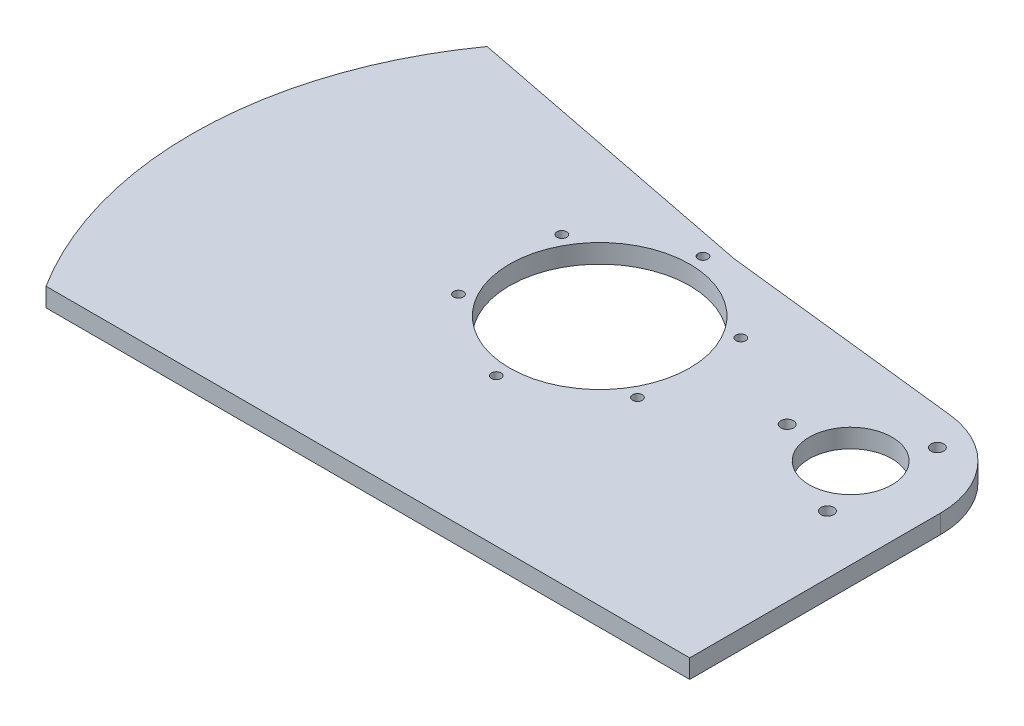
ISO-10303-21;
HEADER;
FILE_DESCRIPTION(('STEP AP214'),'2;1');
FILE_NAME('part.step','',(''),(''),'','','');
FILE_SCHEMA(('AUTOMOTIVE_DESIGN { 1 0 10303 214 1 1 1 1 }'));
ENDSEC;
DATA;
#1=APPLICATION_CONTEXT('core data for automotive mechanical design processes');
#2=APPLICATION_PROTOCOL_DEFINITION('international standard','automotive_design',2000,#1);
#3=PRODUCT_CONTEXT('',#1,'mechanical');
#4=PRODUCT('Part','Part','',(#3));
#5=PRODUCT_RELATED_PRODUCT_CATEGORY('part','',(#4));
#6=PRODUCT_DEFINITION_FORMATION('','',#4);
#7=PRODUCT_DEFINITION_CONTEXT('part definition',#1,'design');
#8=PRODUCT_DEFINITION('design','',#6,#7);
#9=PRODUCT_DEFINITION_SHAPE('','',#8);
#10=(LENGTH_UNIT() NAMED_UNIT(*) SI_UNIT(.MILLI.,.METRE.));
#11=(NAMED_UNIT(*) PLANE_ANGLE_UNIT() SI_UNIT($,.RADIAN.));
#12=(NAMED_UNIT(*) SI_UNIT($,.STERADIAN.) SOLID_ANGLE_UNIT());
#13=UNCERTAINTY_MEASURE_WITH_UNIT(LENGTH_MEASURE(1.E-05),#10,'distance_accuracy_value','');
#14=(GEOMETRIC_REPRESENTATION_CONTEXT(3) GLOBAL_UNCERTAINTY_ASSIGNED_CONTEXT((#13)) GLOBAL_UNIT_ASSIGNED_CONTEXT((#10,
#11,#12)) REPRESENTATION_CONTEXT('',''));
#15=CARTESIAN_POINT('',(0.,0.,0.));
#16=DIRECTION('',(0.,0.,1.));
#17=DIRECTION('',(1.,0.,0.));
#18=AXIS2_PLACEMENT_3D('',#15,#16,#17);
#19=CARTESIAN_POINT('',(4.47058823529412,3.175,-39.7493879302619));
#20=DIRECTION('',(0.111764705882353,0.,-0.993734698256547));
#21=DIRECTION('',(-0.993734698256547,0.,-0.111764705882353));
#22=AXIS2_PLACEMENT_3D('',#19,#20,#21);
#23=PLANE('',#22);
#24=DIRECTION('',(0.993734698256547,0.,0.111764705882353));
#25=VECTOR('',#24,1.);
#26=CARTESIAN_POINT('',(4.47058823529412,-3.175,-39.7493879302619));
#27=LINE('',#26,#25);
#28=CARTESIAN_POINT('',(6.09402337772681,-3.175,-39.5668012182034));
#29=VERTEX_POINT('',#28);
#30=CARTESIAN_POINT('',(88.4088235294118,-3.175,-30.3089082968247));
#31=VERTEX_POINT('',#30);
#32=EDGE_CURVE('E127',#29,#31,#27,.T.);
#33=ORIENTED_EDGE('',*,*,#32,.F.);
#34=DIRECTION('',(0.,-1.,0.));
#35=VECTOR('',#34,1.);
#36=CARTESIAN_POINT('',(6.09402337772681,3.175,-39.5668012182034));
#37=LINE('',#36,#35);
#38=CARTESIAN_POINT('',(6.09402337772681,3.175,-39.5668012182034));
#39=VERTEX_POINT('',#38);
#40=EDGE_CURVE('E11',#39,#29,#37,.T.);
#41=ORIENTED_EDGE('',*,*,#40,.F.);
#42=DIRECTION('',(0.993734698256547,0.,0.111764705882353));
#43=VECTOR('',#42,1.);
#44=CARTESIAN_POINT('',(4.47058823529412,3.175,-39.7493879302619));
#45=LINE('',#44,#43);
#46=CARTESIAN_POINT('',(88.4088235294118,3.175,-30.3089082968247));
#47=VERTEX_POINT('',#46);
#48=EDGE_CURVE('E148',#39,#47,#45,.T.);
#49=ORIENTED_EDGE('',*,*,#48,.T.);
#50=DIRECTION('',(0.,-1.,0.));
#51=VECTOR('',#50,1.);
#52=CARTESIAN_POINT('',(88.4088235294118,3.175,-30.3089082968247));
#53=LINE('',#52,#51);
#54=EDGE_CURVE('E83',#47,#31,#53,.T.);
#55=ORIENTED_EDGE('',*,*,#54,.T.);
#56=EDGE_LOOP('',(#33,#41,#49,#55));
#57=FACE_BOUND('',#56,.T.);
#58=ADVANCED_FACE('F39',(#57),#23,.T.);
#59=CARTESIAN_POINT('',(7.69716210747715,3.175,-39.2524355357883));
#60=DIRECTION('',(0.192429052686929,0.,-0.981310888394708));
#61=DIRECTION('',(-0.981310888394708,0.,-0.192429052686929));
#62=AXIS2_PLACEMENT_3D('',#59,#60,#61);
#63=PLANE('',#62);
#64=DIRECTION('',(0.981310888394708,0.,0.192429052686929));
#65=VECTOR('',#64,1.);
#66=CARTESIAN_POINT('',(7.69716210747715,-3.175,-39.2524355357883));
#67=LINE('',#66,#65);
#68=CARTESIAN_POINT('',(-98.1070843517429,-3.175,-60.));
#69=VERTEX_POINT('',#68);
#70=EDGE_CURVE('E130',#69,#29,#67,.T.);
#71=ORIENTED_EDGE('',*,*,#70,.F.);
#72=DIRECTION('',(0.,-1.,0.));
#73=VECTOR('',#72,1.);
#74=CARTESIAN_POINT('',(-98.1070843517429,3.175,-60.));
#75=LINE('',#74,#73);
#76=CARTESIAN_POINT('',(-98.1070843517429,3.175,-60.));
#77=VERTEX_POINT('',#76);
#78=EDGE_CURVE('E47',#77,#69,#75,.T.);
#79=ORIENTED_EDGE('',*,*,#78,.F.);
#80=DIRECTION('',(0.981310888394708,0.,0.192429052686929));
#81=VECTOR('',#80,1.);
#82=CARTESIAN_POINT('',(7.69716210747715,3.175,-39.2524355357883));
#83=LINE('',#82,#81);
#84=EDGE_CURVE('E161',#77,#39,#83,.T.);
#85=ORIENTED_EDGE('',*,*,#84,.T.);
#86=ORIENTED_EDGE('',*,*,#40,.T.);
#87=EDGE_LOOP('',(#71,#79,#85,#86));
#88=FACE_BOUND('',#87,.T.);
#89=ADVANCED_FACE('F160',(#88),#63,.T.);
#90=CARTESIAN_POINT('',(7.53083374487919,3.175,15.7669470165676));
#91=DIRECTION('',(0.,-1.,0.));
#92=DIRECTION('',(0.,0.,-1.));
#93=AXIS2_PLACEMENT_3D('',#90,#91,#92);
#94=CYLINDRICAL_SURFACE('',#93,130.);
#95=CARTESIAN_POINT('',(7.53083374487919,-3.175,15.7669470165676));
#96=DIRECTION('',(0.,1.,0.));
#97=DIRECTION('',(0.,0.,1.));
#98=AXIS2_PLACEMENT_3D('',#95,#96,#97);
#99=CIRCLE('',#98,130.);
#100=CARTESIAN_POINT('',(-102.5,-3.175,85.));
#101=VERTEX_POINT('',#100);
#102=EDGE_CURVE('E134',#69,#101,#99,.T.);
#103=ORIENTED_EDGE('',*,*,#102,.T.);
#104=DIRECTION('',(0.,-1.,0.));
#105=VECTOR('',#104,1.);
#106=CARTESIAN_POINT('',(-102.5,3.175,85.));
#107=LINE('',#106,#105);
#108=CARTESIAN_POINT('',(-102.5,3.175,85.));
#109=VERTEX_POINT('',#108);
#110=EDGE_CURVE('E106',#109,#101,#107,.T.);
#111=ORIENTED_EDGE('',*,*,#110,.F.);
#112=CARTESIAN_POINT('',(7.53083374487919,3.175,15.7669470165676));
#113=DIRECTION('',(0.,1.,0.));
#114=DIRECTION('',(0.,0.,1.));
#115=AXIS2_PLACEMENT_3D('',#112,#113,#114);
#116=CIRCLE('',#115,130.);
#117=EDGE_CURVE('E113',#77,#109,#116,.T.);
#118=ORIENTED_EDGE('',*,*,#117,.F.);
#119=ORIENTED_EDGE('',*,*,#78,.T.);
#120=EDGE_LOOP('',(#103,#111,#118,#119));
#121=FACE_BOUND('',#120,.T.);
#122=ADVANCED_FACE('F153',(#121),#94,.T.);
#123=CARTESIAN_POINT('',(0.,3.175,85.));
#124=DIRECTION('',(0.,0.,1.));
#125=DIRECTION('',(1.,0.,0.));
#126=AXIS2_PLACEMENT_3D('',#123,#124,#125);
#127=PLANE('',#126);
#128=DIRECTION('',(-1.,0.,0.));
#129=VECTOR('',#128,1.);
#130=CARTESIAN_POINT('',(0.,-3.175,85.));
#131=LINE('',#130,#129);
#132=CARTESIAN_POINT('',(115.5,-3.175,85.));
#133=VERTEX_POINT('',#132);
#134=EDGE_CURVE('E101',#133,#101,#131,.T.);
#135=ORIENTED_EDGE('',*,*,#134,.F.);
#136=DIRECTION('',(0.,-1.,0.));
#137=VECTOR('',#136,1.);
#138=CARTESIAN_POINT('',(115.5,3.175,85.));
#139=LINE('',#138,#137);
#140=CARTESIAN_POINT('',(115.5,3.175,85.));
#141=VERTEX_POINT('',#140);
#142=EDGE_CURVE('E96',#141,#133,#139,.T.);
#143=ORIENTED_EDGE('',*,*,#142,.F.);
#144=DIRECTION('',(-1.,0.,0.));
#145=VECTOR('',#144,1.);
#146=CARTESIAN_POINT('',(0.,3.175,85.));
#147=LINE('',#146,#145);
#148=EDGE_CURVE('E99',#141,#109,#147,.T.);
#149=ORIENTED_EDGE('',*,*,#148,.T.);
#150=ORIENTED_EDGE('',*,*,#110,.T.);
#151=EDGE_LOOP('',(#135,#143,#149,#150));
#152=FACE_BOUND('',#151,.T.);
#153=ADVANCED_FACE('F98',(#152),#127,.T.);
#154=CARTESIAN_POINT('',(115.5,3.175,0.));
#155=DIRECTION('',(1.,0.,0.));
#156=DIRECTION('',(0.,0.,-1.));
#157=AXIS2_PLACEMENT_3D('',#154,#155,#156);
#158=PLANE('',#157);
#159=DIRECTION('',(0.,0.,1.));
#160=VECTOR('',#159,1.);
#161=CARTESIAN_POINT('',(115.5,-3.175,0.));
#162=LINE('',#161,#160);
#163=CARTESIAN_POINT('',(115.5,-3.175,0.));
#164=VERTEX_POINT('',#163);
#165=EDGE_CURVE('E138',#164,#133,#162,.T.);
#166=ORIENTED_EDGE('',*,*,#165,.F.);
#167=DIRECTION('',(0.,-1.,0.));
#168=VECTOR('',#167,1.);
#169=CARTESIAN_POINT('',(115.5,3.175,0.));
#170=LINE('',#169,#168);
#171=CARTESIAN_POINT('',(115.5,3.175,0.));
#172=VERTEX_POINT('',#171);
#173=EDGE_CURVE('E76',#172,#164,#170,.T.);
#174=ORIENTED_EDGE('',*,*,#173,.F.);
#175=DIRECTION('',(0.,0.,1.));
#176=VECTOR('',#175,1.);
#177=CARTESIAN_POINT('',(115.5,3.175,0.));
#178=LINE('',#177,#176);
#179=EDGE_CURVE('E110',#172,#141,#178,.T.);
#180=ORIENTED_EDGE('',*,*,#179,.T.);
#181=ORIENTED_EDGE('',*,*,#142,.T.);
#182=EDGE_LOOP('',(#166,#174,#180,#181));
#183=FACE_BOUND('',#182,.T.);
#184=ADVANCED_FACE('F116',(#183),#158,.T.);
#185=CARTESIAN_POINT('',(0.,3.175,0.));
#186=DIRECTION('',(0.,-1.,0.));
#187=DIRECTION('',(0.,0.,-1.));
#188=AXIS2_PLACEMENT_3D('',#185,#186,#187);
#189=CYLINDRICAL_SURFACE('',#188,30.5);
#190=CARTESIAN_POINT('',(0.,3.175,0.));
#191=DIRECTION('',(0.,1.,0.));
#192=DIRECTION('',(0.,0.,1.));
#193=AXIS2_PLACEMENT_3D('',#190,#191,#192);
#194=CIRCLE('',#193,30.5);
#195=CARTESIAN_POINT('',(0.,3.175,30.5));
#196=VERTEX_POINT('',#195);
#197=EDGE_CURVE('E118',#196,#196,#194,.T.);
#198=ORIENTED_EDGE('',*,*,#197,.T.);
#199=EDGE_LOOP('',(#198));
#200=FACE_BOUND('',#199,.T.);
#201=CARTESIAN_POINT('',(0.,-3.175,0.));
#202=DIRECTION('',(0.,1.,0.));
#203=DIRECTION('',(0.,0.,1.));
#204=AXIS2_PLACEMENT_3D('',#201,#202,#203);
#205=CIRCLE('',#204,30.5);
#206=CARTESIAN_POINT('',(0.,-3.175,30.5));
#207=VERTEX_POINT('',#206);
#208=EDGE_CURVE('E142',#207,#207,#205,.T.);
#209=ORIENTED_EDGE('',*,*,#208,.F.);
#210=EDGE_LOOP('',(#209));
#211=FACE_BOUND('',#210,.T.);
#212=ADVANCED_FACE('F270',(#200,#211),#189,.F.);
#213=CARTESIAN_POINT('',(85.,3.175,0.));
#214=DIRECTION('',(0.,-1.,0.));
#215=DIRECTION('',(0.,0.,-1.));
#216=AXIS2_PLACEMENT_3D('',#213,#214,#215);
#217=CYLINDRICAL_SURFACE('',#216,30.5);
#218=CARTESIAN_POINT('',(85.,-3.175,0.));
#219=DIRECTION('',(0.,1.,0.));
#220=DIRECTION('',(0.,0.,1.));
#221=AXIS2_PLACEMENT_3D('',#218,#219,#220);
#222=CIRCLE('',#221,30.5);
#223=EDGE_CURVE('E140',#164,#31,#222,.T.);
#224=ORIENTED_EDGE('',*,*,#223,.T.);
#225=ORIENTED_EDGE('',*,*,#54,.F.);
#226=CARTESIAN_POINT('',(85.,3.175,0.));
#227=DIRECTION('',(0.,1.,0.));
#228=DIRECTION('',(0.,0.,1.));
#229=AXIS2_PLACEMENT_3D('',#226,#227,#228);
#230=CIRCLE('',#229,30.5);
#231=EDGE_CURVE('E55',#172,#47,#230,.T.);
#232=ORIENTED_EDGE('',*,*,#231,.F.);
#233=ORIENTED_EDGE('',*,*,#173,.T.);
#234=EDGE_LOOP('',(#224,#225,#232,#233));
#235=FACE_BOUND('',#234,.T.);
#236=ADVANCED_FACE('F162',(#235),#217,.T.);
#237=CARTESIAN_POINT('',(85.,3.175,0.));
#238=DIRECTION('',(0.,-1.,0.));
#239=DIRECTION('',(0.,0.,-1.));
#240=AXIS2_PLACEMENT_3D('',#237,#238,#239);
#241=CYLINDRICAL_SURFACE('',#240,14.);
#242=CARTESIAN_POINT('',(85.,3.175,0.));
#243=DIRECTION('',(0.,1.,0.));
#244=DIRECTION('',(0.,0.,1.));
#245=AXIS2_PLACEMENT_3D('',#242,#243,#244);
#246=CIRCLE('',#245,14.);
#247=CARTESIAN_POINT('',(85.,3.175,14.));
#248=VERTEX_POINT('',#247);
#249=EDGE_CURVE('E124',#248,#248,#246,.T.);
#250=ORIENTED_EDGE('',*,*,#249,.T.);
#251=EDGE_LOOP('',(#250));
#252=FACE_BOUND('',#251,.T.);
#253=CARTESIAN_POINT('',(85.,-3.175,0.));
#254=DIRECTION('',(0.,1.,0.));
#255=DIRECTION('',(0.,0.,1.));
#256=AXIS2_PLACEMENT_3D('',#253,#254,#255);
#257=CIRCLE('',#256,14.);
#258=CARTESIAN_POINT('',(85.,-3.175,14.));
#259=VERTEX_POINT('',#258);
#260=EDGE_CURVE('E145',#259,#259,#257,.T.);
#261=ORIENTED_EDGE('',*,*,#260,.F.);
#262=EDGE_LOOP('',(#261));
#263=FACE_BOUND('',#262,.T.);
#264=ADVANCED_FACE('F224',(#252,#263),#241,.F.);
#265=CARTESIAN_POINT('',(0.,3.175,0.));
#266=DIRECTION('',(0.,1.,0.));
#267=DIRECTION('',(0.,0.,1.));
#268=AXIS2_PLACEMENT_3D('',#265,#266,#267);
#269=PLANE('',#268);
#270=CARTESIAN_POINT('',(95.75,3.175,-18.6195461813654));
#271=DIRECTION('',(0.,1.,0.));
#272=DIRECTION('',(0.,0.,1.));
#273=AXIS2_PLACEMENT_3D('',#270,#271,#272);
#274=CIRCLE('',#273,2.15);
#275=CARTESIAN_POINT('',(95.75,3.175,-16.4695461813654));
#276=VERTEX_POINT('',#275);
#277=EDGE_CURVE('E216',#276,#276,#274,.T.);
#278=ORIENTED_EDGE('',*,*,#277,.F.);
#279=EDGE_LOOP('',(#278));
#280=FACE_BOUND('',#279,.T.);
#281=CARTESIAN_POINT('',(95.7500000000001,3.175,18.6195461813654));
#282=DIRECTION('',(0.,1.,0.));
#283=DIRECTION('',(0.,0.,1.));
#284=AXIS2_PLACEMENT_3D('',#281,#282,#283);
#285=CIRCLE('',#284,2.15);
#286=CARTESIAN_POINT('',(95.7500000000001,3.175,20.7695461813654));
#287=VERTEX_POINT('',#286);
#288=EDGE_CURVE('E210',#287,#287,#285,.T.);
#289=ORIENTED_EDGE('',*,*,#288,.F.);
#290=EDGE_LOOP('',(#289));
#291=FACE_BOUND('',#290,.T.);
#292=CARTESIAN_POINT('',(63.5,3.175,0.));
#293=DIRECTION('',(0.,1.,0.));
#294=DIRECTION('',(0.,0.,1.));
#295=AXIS2_PLACEMENT_3D('',#292,#293,#294);
#296=CIRCLE('',#295,2.15);
#297=CARTESIAN_POINT('',(63.5,3.175,2.15000000000004));
#298=VERTEX_POINT('',#297);
#299=EDGE_CURVE('E204',#298,#298,#296,.T.);
#300=ORIENTED_EDGE('',*,*,#299,.F.);
#301=EDGE_LOOP('',(#300));
#302=FACE_BOUND('',#301,.T.);
#303=CARTESIAN_POINT('',(0.,3.175,-35.));
#304=DIRECTION('',(0.,1.,0.));
#305=DIRECTION('',(0.,0.,1.));
#306=AXIS2_PLACEMENT_3D('',#303,#304,#305);
#307=CIRCLE('',#306,1.64999999999999);
#308=CARTESIAN_POINT('',(0.,3.175,-33.35));
#309=VERTEX_POINT('',#308);
#310=EDGE_CURVE('E198',#309,#309,#307,.T.);
#311=ORIENTED_EDGE('',*,*,#310,.F.);
#312=EDGE_LOOP('',(#311));
#313=FACE_BOUND('',#312,.T.);
#314=CARTESIAN_POINT('',(30.3108891324554,3.175,-17.5));
#315=DIRECTION('',(0.,1.,0.));
#316=DIRECTION('',(0.,0.,1.));
#317=AXIS2_PLACEMENT_3D('',#314,#315,#316);
#318=CIRCLE('',#317,1.64999999999999);
#319=CARTESIAN_POINT('',(30.3108891324554,3.175,-15.85));
#320=VERTEX_POINT('',#319);
#321=EDGE_CURVE('E192',#320,#320,#318,.T.);
#322=ORIENTED_EDGE('',*,*,#321,.F.);
#323=EDGE_LOOP('',(#322));
#324=FACE_BOUND('',#323,.T.);
#325=CARTESIAN_POINT('',(30.3108891324554,3.175,17.5));
#326=DIRECTION('',(0.,1.,0.));
#327=DIRECTION('',(0.,0.,1.));
#328=AXIS2_PLACEMENT_3D('',#325,#326,#327);
#329=CIRCLE('',#328,1.64999999999999);
#330=CARTESIAN_POINT('',(30.3108891324554,3.175,19.15));
#331=VERTEX_POINT('',#330);
#332=EDGE_CURVE('E186',#331,#331,#329,.T.);
#333=ORIENTED_EDGE('',*,*,#332,.F.);
#334=EDGE_LOOP('',(#333));
#335=FACE_BOUND('',#334,.T.);
#336=CARTESIAN_POINT('',(0.,3.175,35.));
#337=DIRECTION('',(0.,1.,0.));
#338=DIRECTION('',(0.,0.,1.));
#339=AXIS2_PLACEMENT_3D('',#336,#337,#338);
#340=CIRCLE('',#339,1.64999999999999);
#341=CARTESIAN_POINT('',(0.,3.175,36.65));
#342=VERTEX_POINT('',#341);
#343=EDGE_CURVE('E180',#342,#342,#340,.T.);
#344=ORIENTED_EDGE('',*,*,#343,.F.);
#345=EDGE_LOOP('',(#344));
#346=FACE_BOUND('',#345,.T.);
#347=CARTESIAN_POINT('',(-30.3108891324554,3.175,17.5));
#348=DIRECTION('',(0.,1.,0.));
#349=DIRECTION('',(0.,0.,1.));
#350=AXIS2_PLACEMENT_3D('',#347,#348,#349);
#351=CIRCLE('',#350,1.64999999999999);
#352=CARTESIAN_POINT('',(-30.3108891324554,3.175,19.15));
#353=VERTEX_POINT('',#352);
#354=EDGE_CURVE('E174',#353,#353,#351,.T.);
#355=ORIENTED_EDGE('',*,*,#354,.F.);
#356=EDGE_LOOP('',(#355));
#357=FACE_BOUND('',#356,.T.);
#358=CARTESIAN_POINT('',(-30.3108891324554,3.175,-17.5));
#359=DIRECTION('',(0.,1.,0.));
#360=DIRECTION('',(0.,0.,1.));
#361=AXIS2_PLACEMENT_3D('',#358,#359,#360);
#362=CIRCLE('',#361,1.64999999999999);
#363=CARTESIAN_POINT('',(-30.3108891324554,3.175,-15.85));
#364=VERTEX_POINT('',#363);
#365=EDGE_CURVE('E168',#364,#364,#362,.T.);
#366=ORIENTED_EDGE('',*,*,#365,.F.);
#367=EDGE_LOOP('',(#366));
#368=FACE_BOUND('',#367,.T.);
#369=ORIENTED_EDGE('',*,*,#48,.F.);
#370=ORIENTED_EDGE('',*,*,#84,.F.);
#371=ORIENTED_EDGE('',*,*,#117,.T.);
#372=ORIENTED_EDGE('',*,*,#148,.F.);
#373=ORIENTED_EDGE('',*,*,#179,.F.);
#374=ORIENTED_EDGE('',*,*,#231,.T.);
#375=EDGE_LOOP('',(#369,#370,#371,#372,#373,#374));
#376=FACE_BOUND('',#375,.T.);
#377=ORIENTED_EDGE('',*,*,#197,.F.);
#378=EDGE_LOOP('',(#377));
#379=FACE_BOUND('',#378,.T.);
#380=ORIENTED_EDGE('',*,*,#249,.F.);
#381=EDGE_LOOP('',(#380));
#382=FACE_BOUND('',#381,.T.);
#383=ADVANCED_FACE('F108',(#280,#291,#302,#313,#324,#335,#346,#357,#368,#376,#379,#382),#269,.T.);
#384=CARTESIAN_POINT('',(0.,-3.175,0.));
#385=DIRECTION('',(0.,1.,0.));
#386=DIRECTION('',(0.,0.,1.));
#387=AXIS2_PLACEMENT_3D('',#384,#385,#386);
#388=PLANE('',#387);
#389=CARTESIAN_POINT('',(95.75,-3.175,-18.6195461813654));
#390=DIRECTION('',(0.,1.,0.));
#391=DIRECTION('',(0.,0.,1.));
#392=AXIS2_PLACEMENT_3D('',#389,#390,#391);
#393=CIRCLE('',#392,2.15);
#394=CARTESIAN_POINT('',(95.75,-3.175,-16.4695461813654));
#395=VERTEX_POINT('',#394);
#396=EDGE_CURVE('E213',#395,#395,#393,.T.);
#397=ORIENTED_EDGE('',*,*,#396,.T.);
#398=EDGE_LOOP('',(#397));
#399=FACE_BOUND('',#398,.T.);
#400=CARTESIAN_POINT('',(95.7500000000001,-3.175,18.6195461813654));
#401=DIRECTION('',(0.,1.,0.));
#402=DIRECTION('',(0.,0.,1.));
#403=AXIS2_PLACEMENT_3D('',#400,#401,#402);
#404=CIRCLE('',#403,2.15);
#405=CARTESIAN_POINT('',(95.7500000000001,-3.175,20.7695461813654));
#406=VERTEX_POINT('',#405);
#407=EDGE_CURVE('E207',#406,#406,#404,.T.);
#408=ORIENTED_EDGE('',*,*,#407,.T.);
#409=EDGE_LOOP('',(#408));
#410=FACE_BOUND('',#409,.T.);
#411=CARTESIAN_POINT('',(63.5,-3.175,0.));
#412=DIRECTION('',(0.,1.,0.));
#413=DIRECTION('',(0.,0.,1.));
#414=AXIS2_PLACEMENT_3D('',#411,#412,#413);
#415=CIRCLE('',#414,2.15);
#416=CARTESIAN_POINT('',(63.5,-3.175,2.15000000000004));
#417=VERTEX_POINT('',#416);
#418=EDGE_CURVE('E201',#417,#417,#415,.T.);
#419=ORIENTED_EDGE('',*,*,#418,.T.);
#420=EDGE_LOOP('',(#419));
#421=FACE_BOUND('',#420,.T.);
#422=CARTESIAN_POINT('',(0.,-3.175,-35.));
#423=DIRECTION('',(0.,1.,0.));
#424=DIRECTION('',(0.,0.,1.));
#425=AXIS2_PLACEMENT_3D('',#422,#423,#424);
#426=CIRCLE('',#425,1.64999999999999);
#427=CARTESIAN_POINT('',(0.,-3.175,-33.35));
#428=VERTEX_POINT('',#427);
#429=EDGE_CURVE('E195',#428,#428,#426,.T.);
#430=ORIENTED_EDGE('',*,*,#429,.T.);
#431=EDGE_LOOP('',(#430));
#432=FACE_BOUND('',#431,.T.);
#433=CARTESIAN_POINT('',(30.3108891324554,-3.175,-17.5));
#434=DIRECTION('',(0.,1.,0.));
#435=DIRECTION('',(0.,0.,1.));
#436=AXIS2_PLACEMENT_3D('',#433,#434,#435);
#437=CIRCLE('',#436,1.65);
#438=CARTESIAN_POINT('',(30.3108891324554,-3.175,-15.85));
#439=VERTEX_POINT('',#438);
#440=EDGE_CURVE('E189',#439,#439,#437,.T.);
#441=ORIENTED_EDGE('',*,*,#440,.T.);
#442=EDGE_LOOP('',(#441));
#443=FACE_BOUND('',#442,.T.);
#444=CARTESIAN_POINT('',(30.3108891324554,-3.175,17.5));
#445=DIRECTION('',(0.,1.,0.));
#446=DIRECTION('',(0.,0.,1.));
#447=AXIS2_PLACEMENT_3D('',#444,#445,#446);
#448=CIRCLE('',#447,1.64999999999999);
#449=CARTESIAN_POINT('',(30.3108891324554,-3.175,19.15));
#450=VERTEX_POINT('',#449);
#451=EDGE_CURVE('E183',#450,#450,#448,.T.);
#452=ORIENTED_EDGE('',*,*,#451,.T.);
#453=EDGE_LOOP('',(#452));
#454=FACE_BOUND('',#453,.T.);
#455=CARTESIAN_POINT('',(0.,-3.175,35.));
#456=DIRECTION('',(0.,1.,0.));
#457=DIRECTION('',(0.,0.,1.));
#458=AXIS2_PLACEMENT_3D('',#455,#456,#457);
#459=CIRCLE('',#458,1.64999999999999);
#460=CARTESIAN_POINT('',(0.,-3.175,36.65));
#461=VERTEX_POINT('',#460);
#462=EDGE_CURVE('E177',#461,#461,#459,.T.);
#463=ORIENTED_EDGE('',*,*,#462,.T.);
#464=EDGE_LOOP('',(#463));
#465=FACE_BOUND('',#464,.T.);
#466=CARTESIAN_POINT('',(-30.3108891324554,-3.175,17.5));
#467=DIRECTION('',(0.,1.,0.));
#468=DIRECTION('',(0.,0.,1.));
#469=AXIS2_PLACEMENT_3D('',#466,#467,#468);
#470=CIRCLE('',#469,1.64999999999999);
#471=CARTESIAN_POINT('',(-30.3108891324554,-3.175,19.15));
#472=VERTEX_POINT('',#471);
#473=EDGE_CURVE('E171',#472,#472,#470,.T.);
#474=ORIENTED_EDGE('',*,*,#473,.T.);
#475=EDGE_LOOP('',(#474));
#476=FACE_BOUND('',#475,.T.);
#477=CARTESIAN_POINT('',(-30.3108891324554,-3.175,-17.5));
#478=DIRECTION('',(0.,1.,0.));
#479=DIRECTION('',(0.,0.,1.));
#480=AXIS2_PLACEMENT_3D('',#477,#478,#479);
#481=CIRCLE('',#480,1.64999999999999);
#482=CARTESIAN_POINT('',(-30.3108891324554,-3.175,-15.85));
#483=VERTEX_POINT('',#482);
#484=EDGE_CURVE('E131',#483,#483,#481,.T.);
#485=ORIENTED_EDGE('',*,*,#484,.T.);
#486=EDGE_LOOP('',(#485));
#487=FACE_BOUND('',#486,.T.);
#488=ORIENTED_EDGE('',*,*,#32,.T.);
#489=ORIENTED_EDGE('',*,*,#223,.F.);
#490=ORIENTED_EDGE('',*,*,#165,.T.);
#491=ORIENTED_EDGE('',*,*,#134,.T.);
#492=ORIENTED_EDGE('',*,*,#102,.F.);
#493=ORIENTED_EDGE('',*,*,#70,.T.);
#494=EDGE_LOOP('',(#488,#489,#490,#491,#492,#493));
#495=FACE_BOUND('',#494,.T.);
#496=ORIENTED_EDGE('',*,*,#208,.T.);
#497=EDGE_LOOP('',(#496));
#498=FACE_BOUND('',#497,.T.);
#499=ORIENTED_EDGE('',*,*,#260,.T.);
#500=EDGE_LOOP('',(#499));
#501=FACE_BOUND('',#500,.T.);
#502=ADVANCED_FACE('F158',(#399,#410,#421,#432,#443,#454,#465,#476,#487,#495,#498,#501),#388,.F.);
#503=CARTESIAN_POINT('',(-30.3108891324554,3.175,-17.5));
#504=DIRECTION('',(0.,1.,0.));
#505=DIRECTION('',(0.,0.,1.));
#506=AXIS2_PLACEMENT_3D('',#503,#504,#505);
#507=CYLINDRICAL_SURFACE('',#506,1.64999999999999);
#508=ORIENTED_EDGE('',*,*,#484,.F.);
#509=EDGE_LOOP('',(#508));
#510=FACE_BOUND('',#509,.T.);
#511=ORIENTED_EDGE('',*,*,#365,.T.);
#512=EDGE_LOOP('',(#511));
#513=FACE_BOUND('',#512,.T.);
#514=ADVANCED_FACE('F242',(#510,#513),#507,.F.);
#515=CARTESIAN_POINT('',(-30.3108891324554,3.175,17.5));
#516=DIRECTION('',(0.,1.,0.));
#517=DIRECTION('',(0.,0.,1.));
#518=AXIS2_PLACEMENT_3D('',#515,#516,#517);
#519=CYLINDRICAL_SURFACE('',#518,1.64999999999999);
#520=ORIENTED_EDGE('',*,*,#473,.F.);
#521=EDGE_LOOP('',(#520));
#522=FACE_BOUND('',#521,.T.);
#523=ORIENTED_EDGE('',*,*,#354,.T.);
#524=EDGE_LOOP('',(#523));
#525=FACE_BOUND('',#524,.T.);
#526=ADVANCED_FACE('F244',(#522,#525),#519,.F.);
#527=CARTESIAN_POINT('',(0.,3.175,35.));
#528=DIRECTION('',(0.,1.,0.));
#529=DIRECTION('',(0.,0.,1.));
#530=AXIS2_PLACEMENT_3D('',#527,#528,#529);
#531=CYLINDRICAL_SURFACE('',#530,1.64999999999999);
#532=ORIENTED_EDGE('',*,*,#462,.F.);
#533=EDGE_LOOP('',(#532));
#534=FACE_BOUND('',#533,.T.);
#535=ORIENTED_EDGE('',*,*,#343,.T.);
#536=EDGE_LOOP('',(#535));
#537=FACE_BOUND('',#536,.T.);
#538=ADVANCED_FACE('F251',(#534,#537),#531,.F.);
#539=CARTESIAN_POINT('',(30.3108891324554,3.175,17.5));
#540=DIRECTION('',(0.,1.,0.));
#541=DIRECTION('',(0.,0.,1.));
#542=AXIS2_PLACEMENT_3D('',#539,#540,#541);
#543=CYLINDRICAL_SURFACE('',#542,1.64999999999999);
#544=ORIENTED_EDGE('',*,*,#451,.F.);
#545=EDGE_LOOP('',(#544));
#546=FACE_BOUND('',#545,.T.);
#547=ORIENTED_EDGE('',*,*,#332,.T.);
#548=EDGE_LOOP('',(#547));
#549=FACE_BOUND('',#548,.T.);
#550=ADVANCED_FACE('F342',(#546,#549),#543,.F.);
#551=CARTESIAN_POINT('',(30.3108891324554,3.175,-17.5));
#552=DIRECTION('',(0.,1.,0.));
#553=DIRECTION('',(0.,0.,1.));
#554=AXIS2_PLACEMENT_3D('',#551,#552,#553);
#555=CYLINDRICAL_SURFACE('',#554,1.65);
#556=ORIENTED_EDGE('',*,*,#440,.F.);
#557=EDGE_LOOP('',(#556));
#558=FACE_BOUND('',#557,.T.);
#559=ORIENTED_EDGE('',*,*,#321,.T.);
#560=EDGE_LOOP('',(#559));
#561=FACE_BOUND('',#560,.T.);
#562=ADVANCED_FACE('F338',(#558,#561),#555,.F.);
#563=CARTESIAN_POINT('',(0.,3.175,-35.));
#564=DIRECTION('',(0.,1.,0.));
#565=DIRECTION('',(0.,0.,1.));
#566=AXIS2_PLACEMENT_3D('',#563,#564,#565);
#567=CYLINDRICAL_SURFACE('',#566,1.64999999999999);
#568=ORIENTED_EDGE('',*,*,#429,.F.);
#569=EDGE_LOOP('',(#568));
#570=FACE_BOUND('',#569,.T.);
#571=ORIENTED_EDGE('',*,*,#310,.T.);
#572=EDGE_LOOP('',(#571));
#573=FACE_BOUND('',#572,.T.);
#574=ADVANCED_FACE('F310',(#570,#573),#567,.F.);
#575=CARTESIAN_POINT('',(63.5,3.175,0.));
#576=DIRECTION('',(0.,1.,0.));
#577=DIRECTION('',(0.,0.,1.));
#578=AXIS2_PLACEMENT_3D('',#575,#576,#577);
#579=CYLINDRICAL_SURFACE('',#578,2.15);
#580=ORIENTED_EDGE('',*,*,#418,.F.);
#581=EDGE_LOOP('',(#580));
#582=FACE_BOUND('',#581,.T.);
#583=ORIENTED_EDGE('',*,*,#299,.T.);
#584=EDGE_LOOP('',(#583));
#585=FACE_BOUND('',#584,.T.);
#586=ADVANCED_FACE('F304',(#582,#585),#579,.F.);
#587=CARTESIAN_POINT('',(95.7500000000001,3.175,18.6195461813654));
#588=DIRECTION('',(0.,1.,0.));
#589=DIRECTION('',(0.,0.,1.));
#590=AXIS2_PLACEMENT_3D('',#587,#588,#589);
#591=CYLINDRICAL_SURFACE('',#590,2.15);
#592=ORIENTED_EDGE('',*,*,#407,.F.);
#593=EDGE_LOOP('',(#592));
#594=FACE_BOUND('',#593,.T.);
#595=ORIENTED_EDGE('',*,*,#288,.T.);
#596=EDGE_LOOP('',(#595));
#597=FACE_BOUND('',#596,.T.);
#598=ADVANCED_FACE('F309',(#594,#597),#591,.F.);
#599=CARTESIAN_POINT('',(95.75,3.175,-18.6195461813654));
#600=DIRECTION('',(0.,1.,0.));
#601=DIRECTION('',(0.,0.,1.));
#602=AXIS2_PLACEMENT_3D('',#599,#600,#601);
#603=CYLINDRICAL_SURFACE('',#602,2.15);
#604=ORIENTED_EDGE('',*,*,#396,.F.);
#605=EDGE_LOOP('',(#604));
#606=FACE_BOUND('',#605,.T.);
#607=ORIENTED_EDGE('',*,*,#277,.T.);
#608=EDGE_LOOP('',(#607));
#609=FACE_BOUND('',#608,.T.);
#610=ADVANCED_FACE('F220',(#606,#609),#603,.F.);
#611=CLOSED_SHELL('',(#58,#89,#122,#153,#184,#212,#236,#264,#383,#502,#514,#526,#538,#550,#562,
#574,#586,#598,#610));
#612=MANIFOLD_SOLID_BREP('B2',#611);
#613=ADVANCED_BREP_SHAPE_REPRESENTATION('',(#18,#612),#14);
#614=SHAPE_DEFINITION_REPRESENTATION(#9,#613);
ENDSEC;
END-ISO-10303-21;
